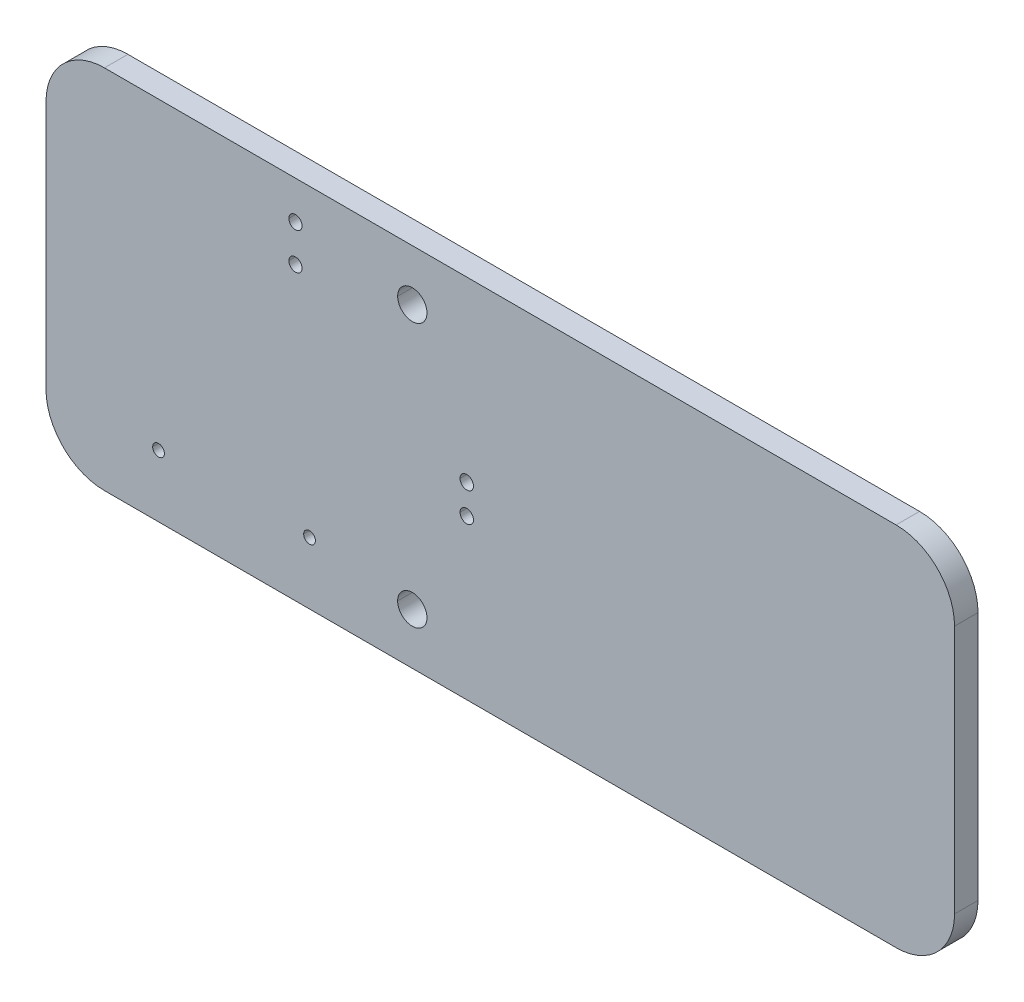
ISO-10303-21;
HEADER;
FILE_DESCRIPTION(('STEP AP214'),'2;1');
FILE_NAME('part.step','',(''),(''),'','','');
FILE_SCHEMA(('AUTOMOTIVE_DESIGN { 1 0 10303 214 1 1 1 1 }'));
ENDSEC;
DATA;
#1=APPLICATION_CONTEXT('core data for automotive mechanical design processes');
#2=APPLICATION_PROTOCOL_DEFINITION('international standard','automotive_design',2000,#1);
#3=PRODUCT_CONTEXT('',#1,'mechanical');
#4=PRODUCT('Part','Part','',(#3));
#5=PRODUCT_RELATED_PRODUCT_CATEGORY('part','',(#4));
#6=PRODUCT_DEFINITION_FORMATION('','',#4);
#7=PRODUCT_DEFINITION_CONTEXT('part definition',#1,'design');
#8=PRODUCT_DEFINITION('design','',#6,#7);
#9=PRODUCT_DEFINITION_SHAPE('','',#8);
#10=(LENGTH_UNIT() NAMED_UNIT(*) SI_UNIT(.MILLI.,.METRE.));
#11=(NAMED_UNIT(*) PLANE_ANGLE_UNIT() SI_UNIT($,.RADIAN.));
#12=(NAMED_UNIT(*) SI_UNIT($,.STERADIAN.) SOLID_ANGLE_UNIT());
#13=UNCERTAINTY_MEASURE_WITH_UNIT(LENGTH_MEASURE(1.E-05),#10,'distance_accuracy_value','');
#14=(GEOMETRIC_REPRESENTATION_CONTEXT(3) GLOBAL_UNCERTAINTY_ASSIGNED_CONTEXT((#13)) GLOBAL_UNIT_ASSIGNED_CONTEXT((#10,
#11,#12)) REPRESENTATION_CONTEXT('',''));
#15=CARTESIAN_POINT('',(0.,0.,0.));
#16=DIRECTION('',(0.,0.,1.));
#17=DIRECTION('',(1.,0.,0.));
#18=AXIS2_PLACEMENT_3D('',#15,#16,#17);
#19=CARTESIAN_POINT('',(1.270002536581E-06,0.,1.600050800102));
#20=DIRECTION('',(0.,0.,-1.));
#21=DIRECTION('',(0.,-1.,0.));
#22=AXIS2_PLACEMENT_3D('',#19,#20,#21);
#23=PLANE('',#22);
#24=CARTESIAN_POINT('',(-2.286004572009,-1.635001270003,1.600050800102));
#25=DIRECTION('',(0.,0.,1.));
#26=DIRECTION('',(-1.,0.,0.));
#27=AXIS2_PLACEMENT_3D('',#24,#25,#26);
#28=CIRCLE('',#27,0.457200914402);
#29=CARTESIAN_POINT('',(-2.743205486411,-1.635001270003,1.600050800102));
#30=VERTEX_POINT('',#29);
#31=CARTESIAN_POINT('',(-1.828803657607,-1.635001270003,1.600050800102));
#32=VERTEX_POINT('',#31);
#33=EDGE_CURVE('E26',#30,#32,#28,.T.);
#34=ORIENTED_EDGE('',*,*,#33,.F.);
#35=CARTESIAN_POINT('',(-2.286004572009,-1.635001270003,1.600050800102));
#36=DIRECTION('',(0.,0.,1.));
#37=DIRECTION('',(1.,0.,0.));
#38=AXIS2_PLACEMENT_3D('',#35,#36,#37);
#39=CIRCLE('',#38,0.457200914402);
#40=EDGE_CURVE('E420',#32,#30,#39,.T.);
#41=ORIENTED_EDGE('',*,*,#40,.F.);
#42=EDGE_LOOP('',(#34,#41));
#43=FACE_BOUND('',#42,.T.);
#44=CARTESIAN_POINT('',(-2.286004572009,0.364998729997,1.600050800102));
#45=DIRECTION('',(0.,0.,1.));
#46=DIRECTION('',(-1.,0.,0.));
#47=AXIS2_PLACEMENT_3D('',#44,#45,#46);
#48=CIRCLE('',#47,0.457200914402);
#49=CARTESIAN_POINT('',(-2.743205486411,0.364998729997,1.600050800102));
#50=VERTEX_POINT('',#49);
#51=CARTESIAN_POINT('',(-1.828803657607,0.364998729997,1.600050800102));
#52=VERTEX_POINT('',#51);
#53=EDGE_CURVE('E326',#50,#52,#48,.T.);
#54=ORIENTED_EDGE('',*,*,#53,.F.);
#55=CARTESIAN_POINT('',(-2.286004572009,0.364998729997,1.600050800102));
#56=DIRECTION('',(0.,0.,1.));
#57=DIRECTION('',(1.,0.,0.));
#58=AXIS2_PLACEMENT_3D('',#55,#56,#57);
#59=CIRCLE('',#58,0.457200914402);
#60=EDGE_CURVE('E421',#52,#50,#59,.T.);
#61=ORIENTED_EDGE('',*,*,#60,.F.);
#62=EDGE_LOOP('',(#54,#61));
#63=FACE_BOUND('',#62,.T.);
#64=CARTESIAN_POINT('',(-6.000012700025,9.000017780036,1.600050800102));
#65=DIRECTION('',(0.,0.,1.));
#66=DIRECTION('',(-1.,0.,0.));
#67=AXIS2_PLACEMENT_3D('',#64,#65,#66);
#68=CIRCLE('',#67,1.000002540005);
#69=CARTESIAN_POINT('',(-7.00001524003,9.000017780036,1.600050800102));
#70=VERTEX_POINT('',#69);
#71=CARTESIAN_POINT('',(-5.00001016002,9.000017780036,1.600050800102));
#72=VERTEX_POINT('',#71);
#73=EDGE_CURVE('E482',#70,#72,#68,.T.);
#74=ORIENTED_EDGE('',*,*,#73,.F.);
#75=CARTESIAN_POINT('',(-6.000012700025,9.000017780036,1.600050800102));
#76=DIRECTION('',(0.,0.,1.));
#77=DIRECTION('',(1.,0.,0.));
#78=AXIS2_PLACEMENT_3D('',#75,#76,#77);
#79=CIRCLE('',#78,1.000002540005);
#80=EDGE_CURVE('E470',#72,#70,#79,.T.);
#81=ORIENTED_EDGE('',*,*,#80,.F.);
#82=EDGE_LOOP('',(#74,#81));
#83=FACE_BOUND('',#82,.T.);
#84=CARTESIAN_POINT('',(-6.000012700025,-9.000017780036,1.600050800102));
#85=DIRECTION('',(0.,0.,1.));
#86=DIRECTION('',(-1.,0.,0.));
#87=AXIS2_PLACEMENT_3D('',#84,#85,#86);
#88=CIRCLE('',#87,1.000002540005);
#89=CARTESIAN_POINT('',(-7.00001524003,-9.000017780036,1.600050800102));
#90=VERTEX_POINT('',#89);
#91=CARTESIAN_POINT('',(-5.00001016002,-9.000017780036,1.600050800102));
#92=VERTEX_POINT('',#91);
#93=EDGE_CURVE('E309',#90,#92,#88,.T.);
#94=ORIENTED_EDGE('',*,*,#93,.F.);
#95=CARTESIAN_POINT('',(-6.000012700025,-9.000017780036,1.600050800102));
#96=DIRECTION('',(0.,0.,1.));
#97=DIRECTION('',(1.,0.,0.));
#98=AXIS2_PLACEMENT_3D('',#95,#96,#97);
#99=CIRCLE('',#98,1.000002540005);
#100=EDGE_CURVE('E453',#92,#90,#99,.T.);
#101=ORIENTED_EDGE('',*,*,#100,.F.);
#102=EDGE_LOOP('',(#94,#101));
#103=FACE_BOUND('',#102,.T.);
#104=CARTESIAN_POINT('',(-13.01102362204,-8.255016510033,1.600050800102));
#105=DIRECTION('',(0.,0.,1.));
#106=DIRECTION('',(-1.,0.,0.));
#107=AXIS2_PLACEMENT_3D('',#104,#105,#106);
#108=CIRCLE('',#107,0.4);
#109=CARTESIAN_POINT('',(-13.41102362204,-8.255016510033,1.600050800102));
#110=VERTEX_POINT('',#109);
#111=CARTESIAN_POINT('',(-12.61102362204,-8.255016510033,1.600050800102));
#112=VERTEX_POINT('',#111);
#113=EDGE_CURVE('E443',#110,#112,#108,.T.);
#114=ORIENTED_EDGE('',*,*,#113,.F.);
#115=CARTESIAN_POINT('',(-13.01102362204,-8.255016510033,1.600050800102));
#116=DIRECTION('',(0.,0.,1.));
#117=DIRECTION('',(1.,0.,0.));
#118=AXIS2_PLACEMENT_3D('',#115,#116,#117);
#119=CIRCLE('',#118,0.4);
#120=EDGE_CURVE('E393',#112,#110,#119,.T.);
#121=ORIENTED_EDGE('',*,*,#120,.F.);
#122=EDGE_LOOP('',(#114,#121));
#123=FACE_BOUND('',#122,.T.);
#124=CARTESIAN_POINT('',(-13.97002794005,7.386004572009,1.600050800102));
#125=DIRECTION('',(0.,0.,1.));
#126=DIRECTION('',(-1.,0.,0.));
#127=AXIS2_PLACEMENT_3D('',#124,#125,#126);
#128=CIRCLE('',#127,0.450012700025);
#129=CARTESIAN_POINT('',(-14.42004064008,7.386004572009,1.600050800102));
#130=VERTEX_POINT('',#129);
#131=CARTESIAN_POINT('',(-13.52001524003,7.386004572009,1.600050800102));
#132=VERTEX_POINT('',#131);
#133=EDGE_CURVE('E284',#130,#132,#128,.T.);
#134=ORIENTED_EDGE('',*,*,#133,.F.);
#135=CARTESIAN_POINT('',(-13.97002794005,7.386004572009,1.600050800102));
#136=DIRECTION('',(0.,0.,1.));
#137=DIRECTION('',(1.,0.,0.));
#138=AXIS2_PLACEMENT_3D('',#135,#136,#137);
#139=CIRCLE('',#138,0.450012700025);
#140=EDGE_CURVE('E378',#132,#130,#139,.T.);
#141=ORIENTED_EDGE('',*,*,#140,.F.);
#142=EDGE_LOOP('',(#134,#141));
#143=FACE_BOUND('',#142,.T.);
#144=CARTESIAN_POINT('',(-13.97002794005,9.88602997206,1.600050800102));
#145=DIRECTION('',(0.,0.,1.));
#146=DIRECTION('',(-1.,0.,0.));
#147=AXIS2_PLACEMENT_3D('',#144,#145,#146);
#148=CIRCLE('',#147,0.450012700025);
#149=CARTESIAN_POINT('',(-14.42004064008,9.88602997206,1.600050800102));
#150=VERTEX_POINT('',#149);
#151=CARTESIAN_POINT('',(-13.52001524003,9.88602997206,1.600050800102));
#152=VERTEX_POINT('',#151);
#153=EDGE_CURVE('E337',#150,#152,#148,.T.);
#154=ORIENTED_EDGE('',*,*,#153,.F.);
#155=CARTESIAN_POINT('',(-13.97002794005,9.88602997206,1.600050800102));
#156=DIRECTION('',(0.,0.,1.));
#157=DIRECTION('',(1.,0.,0.));
#158=AXIS2_PLACEMENT_3D('',#155,#156,#157);
#159=CIRCLE('',#158,0.450012700025);
#160=EDGE_CURVE('E397',#152,#150,#159,.T.);
#161=ORIENTED_EDGE('',*,*,#160,.F.);
#162=EDGE_LOOP('',(#154,#161));
#163=FACE_BOUND('',#162,.T.);
#164=CARTESIAN_POINT('',(-23.31104902209,-8.255016510033,1.600050800102));
#165=DIRECTION('',(0.,0.,1.));
#166=DIRECTION('',(-1.,0.,0.));
#167=AXIS2_PLACEMENT_3D('',#164,#165,#166);
#168=CIRCLE('',#167,0.4);
#169=CARTESIAN_POINT('',(-23.71104902209,-8.255016510033,1.600050800102));
#170=VERTEX_POINT('',#169);
#171=CARTESIAN_POINT('',(-22.91104902209,-8.255016510033,1.600050800102));
#172=VERTEX_POINT('',#171);
#173=EDGE_CURVE('E318',#170,#172,#168,.T.);
#174=ORIENTED_EDGE('',*,*,#173,.F.);
#175=CARTESIAN_POINT('',(-23.31104902209,-8.255016510033,1.600050800102));
#176=DIRECTION('',(0.,0.,1.));
#177=DIRECTION('',(1.,0.,0.));
#178=AXIS2_PLACEMENT_3D('',#175,#176,#177);
#179=CIRCLE('',#178,0.4);
#180=EDGE_CURVE('E369',#172,#170,#179,.T.);
#181=ORIENTED_EDGE('',*,*,#180,.F.);
#182=EDGE_LOOP('',(#174,#181));
#183=FACE_BOUND('',#182,.T.);
#184=CARTESIAN_POINT('',(-27.0000533401,8.500017780036,1.600050800102));
#185=DIRECTION('',(0.,0.,-1.));
#186=DIRECTION('',(-1.,0.,0.));
#187=AXIS2_PLACEMENT_3D('',#184,#185,#186);
#188=CIRCLE('',#187,3.987307594615);
#189=CARTESIAN_POINT('',(-30.98736093472,8.500017780036,1.600050800102));
#190=VERTEX_POINT('',#189);
#191=CARTESIAN_POINT('',(-27.0000533401,12.487325374651,1.600050800102));
#192=VERTEX_POINT('',#191);
#193=EDGE_CURVE('E244',#190,#192,#188,.T.);
#194=ORIENTED_EDGE('',*,*,#193,.F.);
#195=DIRECTION('',(0.,1.,0.));
#196=VECTOR('',#195,1.);
#197=CARTESIAN_POINT('',(-30.98736093472,-8.500017780036,1.600050800102));
#198=LINE('',#197,#196);
#199=CARTESIAN_POINT('',(-30.98736093472,-8.500017780036,1.600050800102));
#200=VERTEX_POINT('',#199);
#201=EDGE_CURVE('E303',#200,#190,#198,.T.);
#202=ORIENTED_EDGE('',*,*,#201,.F.);
#203=CARTESIAN_POINT('',(-27.0000533401,-8.500017780036,1.600050800102));
#204=DIRECTION('',(0.,0.,-1.));
#205=DIRECTION('',(0.,-1.,0.));
#206=AXIS2_PLACEMENT_3D('',#203,#204,#205);
#207=CIRCLE('',#206,3.987307594615);
#208=CARTESIAN_POINT('',(-27.0000533401,-12.48732537465,1.600050800102));
#209=VERTEX_POINT('',#208);
#210=EDGE_CURVE('E345',#209,#200,#207,.T.);
#211=ORIENTED_EDGE('',*,*,#210,.F.);
#212=DIRECTION('',(-1.,0.,0.));
#213=VECTOR('',#212,1.);
#214=CARTESIAN_POINT('',(27.000055880112,-12.48732537465,1.600050800102));
#215=LINE('',#214,#213);
#216=CARTESIAN_POINT('',(27.000055880112,-12.48732537465,1.600050800102));
#217=VERTEX_POINT('',#216);
#218=EDGE_CURVE('E272',#217,#209,#215,.T.);
#219=ORIENTED_EDGE('',*,*,#218,.F.);
#220=CARTESIAN_POINT('',(27.000055880112,-8.500017780036,1.600050800102));
#221=DIRECTION('',(0.,0.,-1.));
#222=DIRECTION('',(1.,0.,0.));
#223=AXIS2_PLACEMENT_3D('',#220,#221,#222);
#224=CIRCLE('',#223,3.987307594615);
#225=CARTESIAN_POINT('',(30.987363474727,-8.500017780036,1.600050800102));
#226=VERTEX_POINT('',#225);
#227=EDGE_CURVE('E308',#226,#217,#224,.T.);
#228=ORIENTED_EDGE('',*,*,#227,.F.);
#229=DIRECTION('',(0.,-1.,0.));
#230=VECTOR('',#229,1.);
#231=CARTESIAN_POINT('',(30.987363474727,8.500017780036,1.600050800102));
#232=LINE('',#231,#230);
#233=CARTESIAN_POINT('',(30.987363474727,8.500017780036,1.600050800102));
#234=VERTEX_POINT('',#233);
#235=EDGE_CURVE('E291',#234,#226,#232,.T.);
#236=ORIENTED_EDGE('',*,*,#235,.F.);
#237=CARTESIAN_POINT('',(27.000055880112,8.500017780036,1.600050800102));
#238=DIRECTION('',(0.,0.,-1.));
#239=DIRECTION('',(0.,1.,0.));
#240=AXIS2_PLACEMENT_3D('',#237,#238,#239);
#241=CIRCLE('',#240,3.987307594615);
#242=CARTESIAN_POINT('',(27.000055880112,12.487325374651,1.600050800102));
#243=VERTEX_POINT('',#242);
#244=EDGE_CURVE('E254',#243,#234,#241,.T.);
#245=ORIENTED_EDGE('',*,*,#244,.F.);
#246=DIRECTION('',(1.,0.,0.));
#247=VECTOR('',#246,1.);
#248=CARTESIAN_POINT('',(-27.0000533401,12.487325374651,1.600050800102));
#249=LINE('',#248,#247);
#250=EDGE_CURVE('E259',#192,#243,#249,.T.);
#251=ORIENTED_EDGE('',*,*,#250,.F.);
#252=EDGE_LOOP('',(#194,#202,#211,#219,#228,#236,#245,#251));
#253=FACE_BOUND('',#252,.T.);
#254=ADVANCED_FACE('F18',(#43,#63,#83,#103,#123,#143,#163,#183,#253),#23,.F.);
#255=CARTESIAN_POINT('',(1.270002536581E-06,0.,0.));
#256=DIRECTION('',(0.,0.,-1.));
#257=DIRECTION('',(0.,-1.,0.));
#258=AXIS2_PLACEMENT_3D('',#255,#256,#257);
#259=PLANE('',#258);
#260=CARTESIAN_POINT('',(-2.286004572009,-1.635001270003,0.));
#261=DIRECTION('',(0.,0.,1.));
#262=DIRECTION('',(1.,0.,0.));
#263=AXIS2_PLACEMENT_3D('',#260,#261,#262);
#264=CIRCLE('',#263,0.457200914402);
#265=CARTESIAN_POINT('',(-1.828803657607,-1.635001270003,0.));
#266=VERTEX_POINT('',#265);
#267=CARTESIAN_POINT('',(-2.743205486411,-1.635001270003,0.));
#268=VERTEX_POINT('',#267);
#269=EDGE_CURVE('E501',#266,#268,#264,.T.);
#270=ORIENTED_EDGE('',*,*,#269,.T.);
#271=CARTESIAN_POINT('',(-2.286004572009,-1.635001270003,0.));
#272=DIRECTION('',(0.,0.,1.));
#273=DIRECTION('',(-1.,0.,0.));
#274=AXIS2_PLACEMENT_3D('',#271,#272,#273);
#275=CIRCLE('',#274,0.457200914402);
#276=EDGE_CURVE('E11',#268,#266,#275,.T.);
#277=ORIENTED_EDGE('',*,*,#276,.T.);
#278=EDGE_LOOP('',(#270,#277));
#279=FACE_BOUND('',#278,.T.);
#280=CARTESIAN_POINT('',(-2.286004572009,0.364998729997,0.));
#281=DIRECTION('',(0.,0.,1.));
#282=DIRECTION('',(1.,0.,0.));
#283=AXIS2_PLACEMENT_3D('',#280,#281,#282);
#284=CIRCLE('',#283,0.457200914402);
#285=CARTESIAN_POINT('',(-1.828803657607,0.364998729997,0.));
#286=VERTEX_POINT('',#285);
#287=CARTESIAN_POINT('',(-2.743205486411,0.364998729997,0.));
#288=VERTEX_POINT('',#287);
#289=EDGE_CURVE('E494',#286,#288,#284,.T.);
#290=ORIENTED_EDGE('',*,*,#289,.T.);
#291=CARTESIAN_POINT('',(-2.286004572009,0.364998729997,0.));
#292=DIRECTION('',(0.,0.,1.));
#293=DIRECTION('',(-1.,0.,0.));
#294=AXIS2_PLACEMENT_3D('',#291,#292,#293);
#295=CIRCLE('',#294,0.457200914402);
#296=EDGE_CURVE('E322',#288,#286,#295,.T.);
#297=ORIENTED_EDGE('',*,*,#296,.T.);
#298=EDGE_LOOP('',(#290,#297));
#299=FACE_BOUND('',#298,.T.);
#300=CARTESIAN_POINT('',(-6.000012700025,9.000017780036,0.));
#301=DIRECTION('',(0.,0.,1.));
#302=DIRECTION('',(1.,0.,0.));
#303=AXIS2_PLACEMENT_3D('',#300,#301,#302);
#304=CIRCLE('',#303,1.000002540005);
#305=CARTESIAN_POINT('',(-5.00001016002,9.000017780036,0.));
#306=VERTEX_POINT('',#305);
#307=CARTESIAN_POINT('',(-7.00001524003,9.000017780036,0.));
#308=VERTEX_POINT('',#307);
#309=EDGE_CURVE('E478',#306,#308,#304,.T.);
#310=ORIENTED_EDGE('',*,*,#309,.T.);
#311=CARTESIAN_POINT('',(-6.000012700025,9.000017780036,0.));
#312=DIRECTION('',(0.,0.,1.));
#313=DIRECTION('',(-1.,0.,0.));
#314=AXIS2_PLACEMENT_3D('',#311,#312,#313);
#315=CIRCLE('',#314,1.000002540005);
#316=EDGE_CURVE('E485',#308,#306,#315,.T.);
#317=ORIENTED_EDGE('',*,*,#316,.T.);
#318=EDGE_LOOP('',(#310,#317));
#319=FACE_BOUND('',#318,.T.);
#320=CARTESIAN_POINT('',(-6.000012700025,-9.000017780036,0.));
#321=DIRECTION('',(0.,0.,1.));
#322=DIRECTION('',(1.,0.,0.));
#323=AXIS2_PLACEMENT_3D('',#320,#321,#322);
#324=CIRCLE('',#323,1.000002540005);
#325=CARTESIAN_POINT('',(-5.00001016002,-9.000017780036,0.));
#326=VERTEX_POINT('',#325);
#327=CARTESIAN_POINT('',(-7.00001524003,-9.000017780036,0.));
#328=VERTEX_POINT('',#327);
#329=EDGE_CURVE('E313',#326,#328,#324,.T.);
#330=ORIENTED_EDGE('',*,*,#329,.T.);
#331=CARTESIAN_POINT('',(-6.000012700025,-9.000017780036,0.));
#332=DIRECTION('',(0.,0.,1.));
#333=DIRECTION('',(-1.,0.,0.));
#334=AXIS2_PLACEMENT_3D('',#331,#332,#333);
#335=CIRCLE('',#334,1.000002540005);
#336=EDGE_CURVE('E312',#328,#326,#335,.T.);
#337=ORIENTED_EDGE('',*,*,#336,.T.);
#338=EDGE_LOOP('',(#330,#337));
#339=FACE_BOUND('',#338,.T.);
#340=CARTESIAN_POINT('',(-13.01102362204,-8.255016510033,0.));
#341=DIRECTION('',(0.,0.,1.));
#342=DIRECTION('',(1.,0.,0.));
#343=AXIS2_PLACEMENT_3D('',#340,#341,#342);
#344=CIRCLE('',#343,0.4);
#345=CARTESIAN_POINT('',(-12.61102362204,-8.255016510033,0.));
#346=VERTEX_POINT('',#345);
#347=CARTESIAN_POINT('',(-13.41102362204,-8.255016510033,0.));
#348=VERTEX_POINT('',#347);
#349=EDGE_CURVE('E392',#346,#348,#344,.T.);
#350=ORIENTED_EDGE('',*,*,#349,.T.);
#351=CARTESIAN_POINT('',(-13.01102362204,-8.255016510033,0.));
#352=DIRECTION('',(0.,0.,1.));
#353=DIRECTION('',(-1.,0.,0.));
#354=AXIS2_PLACEMENT_3D('',#351,#352,#353);
#355=CIRCLE('',#354,0.4);
#356=EDGE_CURVE('E446',#348,#346,#355,.T.);
#357=ORIENTED_EDGE('',*,*,#356,.T.);
#358=EDGE_LOOP('',(#350,#357));
#359=FACE_BOUND('',#358,.T.);
#360=CARTESIAN_POINT('',(-13.97002794005,7.386004572009,0.));
#361=DIRECTION('',(0.,0.,1.));
#362=DIRECTION('',(1.,0.,0.));
#363=AXIS2_PLACEMENT_3D('',#360,#361,#362);
#364=CIRCLE('',#363,0.450012700025);
#365=CARTESIAN_POINT('',(-13.52001524003,7.386004572009,0.));
#366=VERTEX_POINT('',#365);
#367=CARTESIAN_POINT('',(-14.42004064008,7.386004572009,0.));
#368=VERTEX_POINT('',#367);
#369=EDGE_CURVE('E288',#366,#368,#364,.T.);
#370=ORIENTED_EDGE('',*,*,#369,.T.);
#371=CARTESIAN_POINT('',(-13.97002794005,7.386004572009,0.));
#372=DIRECTION('',(0.,0.,1.));
#373=DIRECTION('',(-1.,0.,0.));
#374=AXIS2_PLACEMENT_3D('',#371,#372,#373);
#375=CIRCLE('',#374,0.450012700025);
#376=EDGE_CURVE('E287',#368,#366,#375,.T.);
#377=ORIENTED_EDGE('',*,*,#376,.T.);
#378=EDGE_LOOP('',(#370,#377));
#379=FACE_BOUND('',#378,.T.);
#380=CARTESIAN_POINT('',(-13.97002794005,9.88602997206,0.));
#381=DIRECTION('',(0.,0.,1.));
#382=DIRECTION('',(1.,0.,0.));
#383=AXIS2_PLACEMENT_3D('',#380,#381,#382);
#384=CIRCLE('',#383,0.450012700025);
#385=CARTESIAN_POINT('',(-13.52001524003,9.88602997206,0.));
#386=VERTEX_POINT('',#385);
#387=CARTESIAN_POINT('',(-14.42004064008,9.88602997206,0.));
#388=VERTEX_POINT('',#387);
#389=EDGE_CURVE('E408',#386,#388,#384,.T.);
#390=ORIENTED_EDGE('',*,*,#389,.T.);
#391=CARTESIAN_POINT('',(-13.97002794005,9.88602997206,0.));
#392=DIRECTION('',(0.,0.,1.));
#393=DIRECTION('',(-1.,0.,0.));
#394=AXIS2_PLACEMENT_3D('',#391,#392,#393);
#395=CIRCLE('',#394,0.450012700025);
#396=EDGE_CURVE('E333',#388,#386,#395,.T.);
#397=ORIENTED_EDGE('',*,*,#396,.T.);
#398=EDGE_LOOP('',(#390,#397));
#399=FACE_BOUND('',#398,.T.);
#400=CARTESIAN_POINT('',(-23.31104902209,-8.255016510033,0.));
#401=DIRECTION('',(0.,0.,1.));
#402=DIRECTION('',(1.,0.,0.));
#403=AXIS2_PLACEMENT_3D('',#400,#401,#402);
#404=CIRCLE('',#403,0.4);
#405=CARTESIAN_POINT('',(-22.91104902209,-8.255016510033,0.));
#406=VERTEX_POINT('',#405);
#407=CARTESIAN_POINT('',(-23.71104902209,-8.255016510033,0.));
#408=VERTEX_POINT('',#407);
#409=EDGE_CURVE('E377',#406,#408,#404,.T.);
#410=ORIENTED_EDGE('',*,*,#409,.T.);
#411=CARTESIAN_POINT('',(-23.31104902209,-8.255016510033,0.));
#412=DIRECTION('',(0.,0.,1.));
#413=DIRECTION('',(-1.,0.,0.));
#414=AXIS2_PLACEMENT_3D('',#411,#412,#413);
#415=CIRCLE('',#414,0.4);
#416=EDGE_CURVE('E314',#408,#406,#415,.T.);
#417=ORIENTED_EDGE('',*,*,#416,.T.);
#418=EDGE_LOOP('',(#410,#417));
#419=FACE_BOUND('',#418,.T.);
#420=DIRECTION('',(1.,0.,0.));
#421=VECTOR('',#420,1.);
#422=CARTESIAN_POINT('',(-27.0000533401,12.487325374651,0.));
#423=LINE('',#422,#421);
#424=CARTESIAN_POINT('',(-27.0000533401,12.487325374651,0.));
#425=VERTEX_POINT('',#424);
#426=CARTESIAN_POINT('',(27.000055880112,12.487325374651,0.));
#427=VERTEX_POINT('',#426);
#428=EDGE_CURVE('E234',#425,#427,#423,.T.);
#429=ORIENTED_EDGE('',*,*,#428,.T.);
#430=CARTESIAN_POINT('',(27.000055880112,8.500017780036,0.));
#431=DIRECTION('',(0.,0.,-1.));
#432=DIRECTION('',(0.,1.,0.));
#433=AXIS2_PLACEMENT_3D('',#430,#431,#432);
#434=CIRCLE('',#433,3.987307594615);
#435=CARTESIAN_POINT('',(30.987363474727,8.500017780036,0.));
#436=VERTEX_POINT('',#435);
#437=EDGE_CURVE('E283',#427,#436,#434,.T.);
#438=ORIENTED_EDGE('',*,*,#437,.T.);
#439=DIRECTION('',(0.,-1.,0.));
#440=VECTOR('',#439,1.);
#441=CARTESIAN_POINT('',(30.987363474727,8.500017780036,0.));
#442=LINE('',#441,#440);
#443=CARTESIAN_POINT('',(30.987363474727,-8.500017780036,0.));
#444=VERTEX_POINT('',#443);
#445=EDGE_CURVE('E304',#436,#444,#442,.T.);
#446=ORIENTED_EDGE('',*,*,#445,.T.);
#447=CARTESIAN_POINT('',(27.000055880112,-8.500017780036,0.));
#448=DIRECTION('',(0.,0.,-1.));
#449=DIRECTION('',(1.,0.,0.));
#450=AXIS2_PLACEMENT_3D('',#447,#448,#449);
#451=CIRCLE('',#450,3.987307594615);
#452=CARTESIAN_POINT('',(27.000055880112,-12.48732537465,0.));
#453=VERTEX_POINT('',#452);
#454=EDGE_CURVE('E268',#444,#453,#451,.T.);
#455=ORIENTED_EDGE('',*,*,#454,.T.);
#456=DIRECTION('',(-1.,0.,0.));
#457=VECTOR('',#456,1.);
#458=CARTESIAN_POINT('',(27.000055880112,-12.48732537465,0.));
#459=LINE('',#458,#457);
#460=CARTESIAN_POINT('',(-27.0000533401,-12.48732537465,0.));
#461=VERTEX_POINT('',#460);
#462=EDGE_CURVE('E341',#453,#461,#459,.T.);
#463=ORIENTED_EDGE('',*,*,#462,.T.);
#464=CARTESIAN_POINT('',(-27.0000533401,-8.500017780036,0.));
#465=DIRECTION('',(0.,0.,-1.));
#466=DIRECTION('',(0.,-1.,0.));
#467=AXIS2_PLACEMENT_3D('',#464,#465,#466);
#468=CIRCLE('',#467,3.987307594615);
#469=CARTESIAN_POINT('',(-30.98736093472,-8.500017780036,0.));
#470=VERTEX_POINT('',#469);
#471=EDGE_CURVE('E353',#461,#470,#468,.T.);
#472=ORIENTED_EDGE('',*,*,#471,.T.);
#473=DIRECTION('',(0.,1.,0.));
#474=VECTOR('',#473,1.);
#475=CARTESIAN_POINT('',(-30.98736093472,-8.500017780036,0.));
#476=LINE('',#475,#474);
#477=CARTESIAN_POINT('',(-30.98736093472,8.500017780036,0.));
#478=VERTEX_POINT('',#477);
#479=EDGE_CURVE('E237',#470,#478,#476,.T.);
#480=ORIENTED_EDGE('',*,*,#479,.T.);
#481=CARTESIAN_POINT('',(-27.0000533401,8.500017780036,0.));
#482=DIRECTION('',(0.,0.,-1.));
#483=DIRECTION('',(-1.,0.,0.));
#484=AXIS2_PLACEMENT_3D('',#481,#482,#483);
#485=CIRCLE('',#484,3.987307594615);
#486=EDGE_CURVE('E230',#478,#425,#485,.T.);
#487=ORIENTED_EDGE('',*,*,#486,.T.);
#488=EDGE_LOOP('',(#429,#438,#446,#455,#463,#472,#480,#487));
#489=FACE_BOUND('',#488,.T.);
#490=ADVANCED_FACE('F232',(#279,#299,#319,#339,#359,#379,#399,#419,#489),#259,.T.);
#491=CARTESIAN_POINT('',(-2.286004572009,-1.635001270003,0.));
#492=DIRECTION('',(0.,0.,-1.));
#493=DIRECTION('',(-1.,0.,0.));
#494=AXIS2_PLACEMENT_3D('',#491,#492,#493);
#495=CYLINDRICAL_SURFACE('',#494,0.457200914402);
#496=DIRECTION('',(0.,0.,1.));
#497=VECTOR('',#496,1.);
#498=CARTESIAN_POINT('',(-2.743205486411,-1.635001270003,0.));
#499=LINE('',#498,#497);
#500=EDGE_CURVE('E439',#268,#30,#499,.T.);
#501=ORIENTED_EDGE('',*,*,#500,.T.);
#502=ORIENTED_EDGE('',*,*,#33,.T.);
#503=DIRECTION('',(0.,0.,1.));
#504=VECTOR('',#503,1.);
#505=CARTESIAN_POINT('',(-1.828803657607,-1.635001270003,0.));
#506=LINE('',#505,#504);
#507=EDGE_CURVE('E325',#266,#32,#506,.T.);
#508=ORIENTED_EDGE('',*,*,#507,.F.);
#509=ORIENTED_EDGE('',*,*,#276,.F.);
#510=EDGE_LOOP('',(#501,#502,#508,#509));
#511=FACE_BOUND('',#510,.T.);
#512=ADVANCED_FACE('F511',(#511),#495,.F.);
#513=CARTESIAN_POINT('',(-2.286004572009,-1.635001270003,0.));
#514=DIRECTION('',(0.,0.,-1.));
#515=DIRECTION('',(1.,0.,0.));
#516=AXIS2_PLACEMENT_3D('',#513,#514,#515);
#517=CYLINDRICAL_SURFACE('',#516,0.457200914402);
#518=ORIENTED_EDGE('',*,*,#507,.T.);
#519=ORIENTED_EDGE('',*,*,#40,.T.);
#520=ORIENTED_EDGE('',*,*,#500,.F.);
#521=ORIENTED_EDGE('',*,*,#269,.F.);
#522=EDGE_LOOP('',(#518,#519,#520,#521));
#523=FACE_BOUND('',#522,.T.);
#524=ADVANCED_FACE('F514',(#523),#517,.F.);
#525=CARTESIAN_POINT('',(-2.286004572009,0.364998729997,0.));
#526=DIRECTION('',(0.,0.,-1.));
#527=DIRECTION('',(-1.,0.,0.));
#528=AXIS2_PLACEMENT_3D('',#525,#526,#527);
#529=CYLINDRICAL_SURFACE('',#528,0.457200914402);
#530=DIRECTION('',(0.,0.,1.));
#531=VECTOR('',#530,1.);
#532=CARTESIAN_POINT('',(-2.743205486411,0.364998729997,0.));
#533=LINE('',#532,#531);
#534=EDGE_CURVE('E425',#288,#50,#533,.T.);
#535=ORIENTED_EDGE('',*,*,#534,.T.);
#536=ORIENTED_EDGE('',*,*,#53,.T.);
#537=DIRECTION('',(0.,0.,1.));
#538=VECTOR('',#537,1.);
#539=CARTESIAN_POINT('',(-1.828803657607,0.364998729997,0.));
#540=LINE('',#539,#538);
#541=EDGE_CURVE('E426',#286,#52,#540,.T.);
#542=ORIENTED_EDGE('',*,*,#541,.F.);
#543=ORIENTED_EDGE('',*,*,#296,.F.);
#544=EDGE_LOOP('',(#535,#536,#542,#543));
#545=FACE_BOUND('',#544,.T.);
#546=ADVANCED_FACE('F516',(#545),#529,.F.);
#547=CARTESIAN_POINT('',(-2.286004572009,0.364998729997,0.));
#548=DIRECTION('',(0.,0.,-1.));
#549=DIRECTION('',(1.,0.,0.));
#550=AXIS2_PLACEMENT_3D('',#547,#548,#549);
#551=CYLINDRICAL_SURFACE('',#550,0.457200914402);
#552=ORIENTED_EDGE('',*,*,#541,.T.);
#553=ORIENTED_EDGE('',*,*,#60,.T.);
#554=ORIENTED_EDGE('',*,*,#534,.F.);
#555=ORIENTED_EDGE('',*,*,#289,.F.);
#556=EDGE_LOOP('',(#552,#553,#554,#555));
#557=FACE_BOUND('',#556,.T.);
#558=ADVANCED_FACE('F524',(#557),#551,.F.);
#559=CARTESIAN_POINT('',(-6.000012700025,9.000017780036,0.));
#560=DIRECTION('',(0.,0.,-1.));
#561=DIRECTION('',(-1.,0.,0.));
#562=AXIS2_PLACEMENT_3D('',#559,#560,#561);
#563=CYLINDRICAL_SURFACE('',#562,1.000002540005);
#564=DIRECTION('',(0.,0.,1.));
#565=VECTOR('',#564,1.);
#566=CARTESIAN_POINT('',(-7.00001524003,9.000017780036,0.));
#567=LINE('',#566,#565);
#568=EDGE_CURVE('E474',#308,#70,#567,.T.);
#569=ORIENTED_EDGE('',*,*,#568,.T.);
#570=ORIENTED_EDGE('',*,*,#73,.T.);
#571=DIRECTION('',(0.,0.,1.));
#572=VECTOR('',#571,1.);
#573=CARTESIAN_POINT('',(-5.00001016002,9.000017780036,0.));
#574=LINE('',#573,#572);
#575=EDGE_CURVE('E466',#306,#72,#574,.T.);
#576=ORIENTED_EDGE('',*,*,#575,.F.);
#577=ORIENTED_EDGE('',*,*,#316,.F.);
#578=EDGE_LOOP('',(#569,#570,#576,#577));
#579=FACE_BOUND('',#578,.T.);
#580=ADVANCED_FACE('F639',(#579),#563,.F.);
#581=CARTESIAN_POINT('',(-6.000012700025,9.000017780036,0.));
#582=DIRECTION('',(0.,0.,-1.));
#583=DIRECTION('',(1.,0.,0.));
#584=AXIS2_PLACEMENT_3D('',#581,#582,#583);
#585=CYLINDRICAL_SURFACE('',#584,1.000002540005);
#586=ORIENTED_EDGE('',*,*,#575,.T.);
#587=ORIENTED_EDGE('',*,*,#80,.T.);
#588=ORIENTED_EDGE('',*,*,#568,.F.);
#589=ORIENTED_EDGE('',*,*,#309,.F.);
#590=EDGE_LOOP('',(#586,#587,#588,#589));
#591=FACE_BOUND('',#590,.T.);
#592=ADVANCED_FACE('F635',(#591),#585,.F.);
#593=CARTESIAN_POINT('',(-6.000012700025,-9.000017780036,0.));
#594=DIRECTION('',(0.,0.,-1.));
#595=DIRECTION('',(-1.,0.,0.));
#596=AXIS2_PLACEMENT_3D('',#593,#594,#595);
#597=CYLINDRICAL_SURFACE('',#596,1.000002540005);
#598=DIRECTION('',(0.,0.,1.));
#599=VECTOR('',#598,1.);
#600=CARTESIAN_POINT('',(-7.00001524003,-9.000017780036,0.));
#601=LINE('',#600,#599);
#602=EDGE_CURVE('E457',#328,#90,#601,.T.);
#603=ORIENTED_EDGE('',*,*,#602,.T.);
#604=ORIENTED_EDGE('',*,*,#93,.T.);
#605=DIRECTION('',(0.,0.,1.));
#606=VECTOR('',#605,1.);
#607=CARTESIAN_POINT('',(-5.00001016002,-9.000017780036,0.));
#608=LINE('',#607,#606);
#609=EDGE_CURVE('E449',#326,#92,#608,.T.);
#610=ORIENTED_EDGE('',*,*,#609,.F.);
#611=ORIENTED_EDGE('',*,*,#336,.F.);
#612=EDGE_LOOP('',(#603,#604,#610,#611));
#613=FACE_BOUND('',#612,.T.);
#614=ADVANCED_FACE('F607',(#613),#597,.F.);
#615=CARTESIAN_POINT('',(-6.000012700025,-9.000017780036,0.));
#616=DIRECTION('',(0.,0.,-1.));
#617=DIRECTION('',(1.,0.,0.));
#618=AXIS2_PLACEMENT_3D('',#615,#616,#617);
#619=CYLINDRICAL_SURFACE('',#618,1.000002540005);
#620=ORIENTED_EDGE('',*,*,#609,.T.);
#621=ORIENTED_EDGE('',*,*,#100,.T.);
#622=ORIENTED_EDGE('',*,*,#602,.F.);
#623=ORIENTED_EDGE('',*,*,#329,.F.);
#624=EDGE_LOOP('',(#620,#621,#622,#623));
#625=FACE_BOUND('',#624,.T.);
#626=ADVANCED_FACE('F603',(#625),#619,.F.);
#627=CARTESIAN_POINT('',(-13.01102362204,-8.255016510033,0.));
#628=DIRECTION('',(0.,0.,-1.));
#629=DIRECTION('',(-1.,0.,0.));
#630=AXIS2_PLACEMENT_3D('',#627,#628,#629);
#631=CYLINDRICAL_SURFACE('',#630,0.4);
#632=DIRECTION('',(0.,0.,1.));
#633=VECTOR('',#632,1.);
#634=CARTESIAN_POINT('',(-13.41102362204,-8.255016510033,0.));
#635=LINE('',#634,#633);
#636=EDGE_CURVE('E388',#348,#110,#635,.T.);
#637=ORIENTED_EDGE('',*,*,#636,.T.);
#638=ORIENTED_EDGE('',*,*,#113,.T.);
#639=DIRECTION('',(0.,0.,1.));
#640=VECTOR('',#639,1.);
#641=CARTESIAN_POINT('',(-12.61102362204,-8.255016510033,0.));
#642=LINE('',#641,#640);
#643=EDGE_CURVE('E364',#346,#112,#642,.T.);
#644=ORIENTED_EDGE('',*,*,#643,.F.);
#645=ORIENTED_EDGE('',*,*,#356,.F.);
#646=EDGE_LOOP('',(#637,#638,#644,#645));
#647=FACE_BOUND('',#646,.T.);
#648=ADVANCED_FACE('F599',(#647),#631,.F.);
#649=CARTESIAN_POINT('',(-13.01102362204,-8.255016510033,0.));
#650=DIRECTION('',(0.,0.,-1.));
#651=DIRECTION('',(1.,0.,0.));
#652=AXIS2_PLACEMENT_3D('',#649,#650,#651);
#653=CYLINDRICAL_SURFACE('',#652,0.4);
#654=ORIENTED_EDGE('',*,*,#643,.T.);
#655=ORIENTED_EDGE('',*,*,#120,.T.);
#656=ORIENTED_EDGE('',*,*,#636,.F.);
#657=ORIENTED_EDGE('',*,*,#349,.F.);
#658=EDGE_LOOP('',(#654,#655,#656,#657));
#659=FACE_BOUND('',#658,.T.);
#660=ADVANCED_FACE('F602',(#659),#653,.F.);
#661=CARTESIAN_POINT('',(-13.97002794005,7.386004572009,0.));
#662=DIRECTION('',(0.,0.,-1.));
#663=DIRECTION('',(-1.,0.,0.));
#664=AXIS2_PLACEMENT_3D('',#661,#662,#663);
#665=CYLINDRICAL_SURFACE('',#664,0.450012700025);
#666=DIRECTION('',(0.,0.,1.));
#667=VECTOR('',#666,1.);
#668=CARTESIAN_POINT('',(-14.42004064008,7.386004572009,0.));
#669=LINE('',#668,#667);
#670=EDGE_CURVE('E382',#368,#130,#669,.T.);
#671=ORIENTED_EDGE('',*,*,#670,.T.);
#672=ORIENTED_EDGE('',*,*,#133,.T.);
#673=DIRECTION('',(0.,0.,1.));
#674=VECTOR('',#673,1.);
#675=CARTESIAN_POINT('',(-13.52001524003,7.386004572009,0.));
#676=LINE('',#675,#674);
#677=EDGE_CURVE('E336',#366,#132,#676,.T.);
#678=ORIENTED_EDGE('',*,*,#677,.F.);
#679=ORIENTED_EDGE('',*,*,#376,.F.);
#680=EDGE_LOOP('',(#671,#672,#678,#679));
#681=FACE_BOUND('',#680,.T.);
#682=ADVANCED_FACE('F619',(#681),#665,.F.);
#683=CARTESIAN_POINT('',(-13.97002794005,7.386004572009,0.));
#684=DIRECTION('',(0.,0.,-1.));
#685=DIRECTION('',(1.,0.,0.));
#686=AXIS2_PLACEMENT_3D('',#683,#684,#685);
#687=CYLINDRICAL_SURFACE('',#686,0.450012700025);
#688=ORIENTED_EDGE('',*,*,#677,.T.);
#689=ORIENTED_EDGE('',*,*,#140,.T.);
#690=ORIENTED_EDGE('',*,*,#670,.F.);
#691=ORIENTED_EDGE('',*,*,#369,.F.);
#692=EDGE_LOOP('',(#688,#689,#690,#691));
#693=FACE_BOUND('',#692,.T.);
#694=ADVANCED_FACE('F615',(#693),#687,.F.);
#695=CARTESIAN_POINT('',(-13.97002794005,9.88602997206,0.));
#696=DIRECTION('',(0.,0.,-1.));
#697=DIRECTION('',(-1.,0.,0.));
#698=AXIS2_PLACEMENT_3D('',#695,#696,#697);
#699=CYLINDRICAL_SURFACE('',#698,0.450012700025);
#700=DIRECTION('',(0.,0.,1.));
#701=VECTOR('',#700,1.);
#702=CARTESIAN_POINT('',(-14.42004064008,9.88602997206,0.));
#703=LINE('',#702,#701);
#704=EDGE_CURVE('E404',#388,#150,#703,.T.);
#705=ORIENTED_EDGE('',*,*,#704,.T.);
#706=ORIENTED_EDGE('',*,*,#153,.T.);
#707=DIRECTION('',(0.,0.,1.));
#708=VECTOR('',#707,1.);
#709=CARTESIAN_POINT('',(-13.52001524003,9.88602997206,0.));
#710=LINE('',#709,#708);
#711=EDGE_CURVE('E317',#386,#152,#710,.T.);
#712=ORIENTED_EDGE('',*,*,#711,.F.);
#713=ORIENTED_EDGE('',*,*,#396,.F.);
#714=EDGE_LOOP('',(#705,#706,#712,#713));
#715=FACE_BOUND('',#714,.T.);
#716=ADVANCED_FACE('F618',(#715),#699,.F.);
#717=CARTESIAN_POINT('',(-13.97002794005,9.88602997206,0.));
#718=DIRECTION('',(0.,0.,-1.));
#719=DIRECTION('',(1.,0.,0.));
#720=AXIS2_PLACEMENT_3D('',#717,#718,#719);
#721=CYLINDRICAL_SURFACE('',#720,0.450012700025);
#722=ORIENTED_EDGE('',*,*,#711,.T.);
#723=ORIENTED_EDGE('',*,*,#160,.T.);
#724=ORIENTED_EDGE('',*,*,#704,.F.);
#725=ORIENTED_EDGE('',*,*,#389,.F.);
#726=EDGE_LOOP('',(#722,#723,#724,#725));
#727=FACE_BOUND('',#726,.T.);
#728=ADVANCED_FACE('F623',(#727),#721,.F.);
#729=CARTESIAN_POINT('',(-23.31104902209,-8.255016510033,0.));
#730=DIRECTION('',(0.,0.,-1.));
#731=DIRECTION('',(-1.,0.,0.));
#732=AXIS2_PLACEMENT_3D('',#729,#730,#731);
#733=CYLINDRICAL_SURFACE('',#732,0.4);
#734=DIRECTION('',(0.,0.,1.));
#735=VECTOR('',#734,1.);
#736=CARTESIAN_POINT('',(-23.71104902209,-8.255016510033,0.));
#737=LINE('',#736,#735);
#738=EDGE_CURVE('E373',#408,#170,#737,.T.);
#739=ORIENTED_EDGE('',*,*,#738,.T.);
#740=ORIENTED_EDGE('',*,*,#173,.T.);
#741=DIRECTION('',(0.,0.,1.));
#742=VECTOR('',#741,1.);
#743=CARTESIAN_POINT('',(-22.91104902209,-8.255016510033,0.));
#744=LINE('',#743,#742);
#745=EDGE_CURVE('E243',#406,#172,#744,.T.);
#746=ORIENTED_EDGE('',*,*,#745,.F.);
#747=ORIENTED_EDGE('',*,*,#416,.F.);
#748=EDGE_LOOP('',(#739,#740,#746,#747));
#749=FACE_BOUND('',#748,.T.);
#750=ADVANCED_FACE('F562',(#749),#733,.F.);
#751=CARTESIAN_POINT('',(-23.31104902209,-8.255016510033,0.));
#752=DIRECTION('',(0.,0.,-1.));
#753=DIRECTION('',(1.,0.,0.));
#754=AXIS2_PLACEMENT_3D('',#751,#752,#753);
#755=CYLINDRICAL_SURFACE('',#754,0.4);
#756=ORIENTED_EDGE('',*,*,#745,.T.);
#757=ORIENTED_EDGE('',*,*,#180,.T.);
#758=ORIENTED_EDGE('',*,*,#738,.F.);
#759=ORIENTED_EDGE('',*,*,#409,.F.);
#760=EDGE_LOOP('',(#756,#757,#758,#759));
#761=FACE_BOUND('',#760,.T.);
#762=ADVANCED_FACE('F559',(#761),#755,.F.);
#763=CARTESIAN_POINT('',(-27.0000533401,8.500017780036,0.));
#764=DIRECTION('',(0.,0.,-1.));
#765=DIRECTION('',(-1.,0.,0.));
#766=AXIS2_PLACEMENT_3D('',#763,#764,#765);
#767=CYLINDRICAL_SURFACE('',#766,3.987307594615);
#768=DIRECTION('',(0.,0.,1.));
#769=VECTOR('',#768,1.);
#770=CARTESIAN_POINT('',(-30.98736093472,8.500017780036,0.));
#771=LINE('',#770,#769);
#772=EDGE_CURVE('E300',#478,#190,#771,.T.);
#773=ORIENTED_EDGE('',*,*,#772,.T.);
#774=ORIENTED_EDGE('',*,*,#193,.T.);
#775=DIRECTION('',(0.,0.,1.));
#776=VECTOR('',#775,1.);
#777=CARTESIAN_POINT('',(-27.0000533401,12.487325374651,0.));
#778=LINE('',#777,#776);
#779=EDGE_CURVE('E250',#425,#192,#778,.T.);
#780=ORIENTED_EDGE('',*,*,#779,.F.);
#781=ORIENTED_EDGE('',*,*,#486,.F.);
#782=EDGE_LOOP('',(#773,#774,#780,#781));
#783=FACE_BOUND('',#782,.T.);
#784=ADVANCED_FACE('F256',(#783),#767,.T.);
#785=CARTESIAN_POINT('',(-30.98736093472,-8.500017780036,0.));
#786=DIRECTION('',(-1.,0.,0.));
#787=DIRECTION('',(0.,0.,1.));
#788=AXIS2_PLACEMENT_3D('',#785,#786,#787);
#789=PLANE('',#788);
#790=DIRECTION('',(0.,0.,1.));
#791=VECTOR('',#790,1.);
#792=CARTESIAN_POINT('',(-30.98736093472,-8.500017780036,0.));
#793=LINE('',#792,#791);
#794=EDGE_CURVE('E349',#470,#200,#793,.T.);
#795=ORIENTED_EDGE('',*,*,#794,.T.);
#796=ORIENTED_EDGE('',*,*,#201,.T.);
#797=ORIENTED_EDGE('',*,*,#772,.F.);
#798=ORIENTED_EDGE('',*,*,#479,.F.);
#799=EDGE_LOOP('',(#795,#796,#797,#798));
#800=FACE_BOUND('',#799,.T.);
#801=ADVANCED_FACE('F566',(#800),#789,.T.);
#802=CARTESIAN_POINT('',(-27.0000533401,-8.500017780036,0.));
#803=DIRECTION('',(0.,0.,-1.));
#804=DIRECTION('',(0.,-1.,0.));
#805=AXIS2_PLACEMENT_3D('',#802,#803,#804);
#806=CYLINDRICAL_SURFACE('',#805,3.987307594615);
#807=DIRECTION('',(0.,0.,1.));
#808=VECTOR('',#807,1.);
#809=CARTESIAN_POINT('',(-27.0000533401,-12.48732537465,0.));
#810=LINE('',#809,#808);
#811=EDGE_CURVE('E299',#461,#209,#810,.T.);
#812=ORIENTED_EDGE('',*,*,#811,.T.);
#813=ORIENTED_EDGE('',*,*,#210,.T.);
#814=ORIENTED_EDGE('',*,*,#794,.F.);
#815=ORIENTED_EDGE('',*,*,#471,.F.);
#816=EDGE_LOOP('',(#812,#813,#814,#815));
#817=FACE_BOUND('',#816,.T.);
#818=ADVANCED_FACE('F569',(#817),#806,.T.);
#819=CARTESIAN_POINT('',(27.000055880112,-12.48732537465,0.));
#820=DIRECTION('',(0.,-1.,0.));
#821=DIRECTION('',(-1.,0.,0.));
#822=AXIS2_PLACEMENT_3D('',#819,#820,#821);
#823=PLANE('',#822);
#824=DIRECTION('',(0.,0.,1.));
#825=VECTOR('',#824,1.);
#826=CARTESIAN_POINT('',(27.000055880112,-12.48732537465,0.));
#827=LINE('',#826,#825);
#828=EDGE_CURVE('E273',#453,#217,#827,.T.);
#829=ORIENTED_EDGE('',*,*,#828,.T.);
#830=ORIENTED_EDGE('',*,*,#218,.T.);
#831=ORIENTED_EDGE('',*,*,#811,.F.);
#832=ORIENTED_EDGE('',*,*,#462,.F.);
#833=EDGE_LOOP('',(#829,#830,#831,#832));
#834=FACE_BOUND('',#833,.T.);
#835=ADVANCED_FACE('F573',(#834),#823,.T.);
#836=CARTESIAN_POINT('',(27.000055880112,-8.500017780036,0.));
#837=DIRECTION('',(0.,0.,-1.));
#838=DIRECTION('',(1.,0.,0.));
#839=AXIS2_PLACEMENT_3D('',#836,#837,#838);
#840=CYLINDRICAL_SURFACE('',#839,3.987307594615);
#841=DIRECTION('',(0.,0.,1.));
#842=VECTOR('',#841,1.);
#843=CARTESIAN_POINT('',(30.987363474727,-8.500017780036,0.));
#844=LINE('',#843,#842);
#845=EDGE_CURVE('E295',#444,#226,#844,.T.);
#846=ORIENTED_EDGE('',*,*,#845,.T.);
#847=ORIENTED_EDGE('',*,*,#227,.T.);
#848=ORIENTED_EDGE('',*,*,#828,.F.);
#849=ORIENTED_EDGE('',*,*,#454,.F.);
#850=EDGE_LOOP('',(#846,#847,#848,#849));
#851=FACE_BOUND('',#850,.T.);
#852=ADVANCED_FACE('F575',(#851),#840,.T.);
#853=CARTESIAN_POINT('',(30.987363474727,8.500017780036,0.));
#854=DIRECTION('',(1.,0.,0.));
#855=DIRECTION('',(0.,1.,0.));
#856=AXIS2_PLACEMENT_3D('',#853,#854,#855);
#857=PLANE('',#856);
#858=DIRECTION('',(0.,0.,1.));
#859=VECTOR('',#858,1.);
#860=CARTESIAN_POINT('',(30.987363474727,8.500017780036,0.));
#861=LINE('',#860,#859);
#862=EDGE_CURVE('E278',#436,#234,#861,.T.);
#863=ORIENTED_EDGE('',*,*,#862,.T.);
#864=ORIENTED_EDGE('',*,*,#235,.T.);
#865=ORIENTED_EDGE('',*,*,#845,.F.);
#866=ORIENTED_EDGE('',*,*,#445,.F.);
#867=EDGE_LOOP('',(#863,#864,#865,#866));
#868=FACE_BOUND('',#867,.T.);
#869=ADVANCED_FACE('F578',(#868),#857,.T.);
#870=CARTESIAN_POINT('',(27.000055880112,8.500017780036,0.));
#871=DIRECTION('',(0.,0.,-1.));
#872=DIRECTION('',(0.,1.,0.));
#873=AXIS2_PLACEMENT_3D('',#870,#871,#872);
#874=CYLINDRICAL_SURFACE('',#873,3.987307594615);
#875=DIRECTION('',(0.,0.,1.));
#876=VECTOR('',#875,1.);
#877=CARTESIAN_POINT('',(27.000055880112,12.487325374651,0.));
#878=LINE('',#877,#876);
#879=EDGE_CURVE('E252',#427,#243,#878,.T.);
#880=ORIENTED_EDGE('',*,*,#879,.T.);
#881=ORIENTED_EDGE('',*,*,#244,.T.);
#882=ORIENTED_EDGE('',*,*,#862,.F.);
#883=ORIENTED_EDGE('',*,*,#437,.F.);
#884=EDGE_LOOP('',(#880,#881,#882,#883));
#885=FACE_BOUND('',#884,.T.);
#886=ADVANCED_FACE('F581',(#885),#874,.T.);
#887=CARTESIAN_POINT('',(-27.0000533401,12.487325374651,0.));
#888=DIRECTION('',(0.,1.,0.));
#889=DIRECTION('',(1.,0.,0.));
#890=AXIS2_PLACEMENT_3D('',#887,#888,#889);
#891=PLANE('',#890);
#892=ORIENTED_EDGE('',*,*,#779,.T.);
#893=ORIENTED_EDGE('',*,*,#250,.T.);
#894=ORIENTED_EDGE('',*,*,#879,.F.);
#895=ORIENTED_EDGE('',*,*,#428,.F.);
#896=EDGE_LOOP('',(#892,#893,#894,#895));
#897=FACE_BOUND('',#896,.T.);
#898=ADVANCED_FACE('F248',(#897),#891,.T.);
#899=CLOSED_SHELL('',(#254,#490,#512,#524,#546,#558,#580,#592,#614,#626,#648,#660,#682,#694,
#716,#728,#750,#762,#784,#801,#818,#835,#852,#869,#886,#898));
#900=MANIFOLD_SOLID_BREP('B1',#899);
#901=ADVANCED_BREP_SHAPE_REPRESENTATION('',(#18,#900),#14);
#902=SHAPE_DEFINITION_REPRESENTATION(#9,#901);
ENDSEC;
END-ISO-10303-21;
